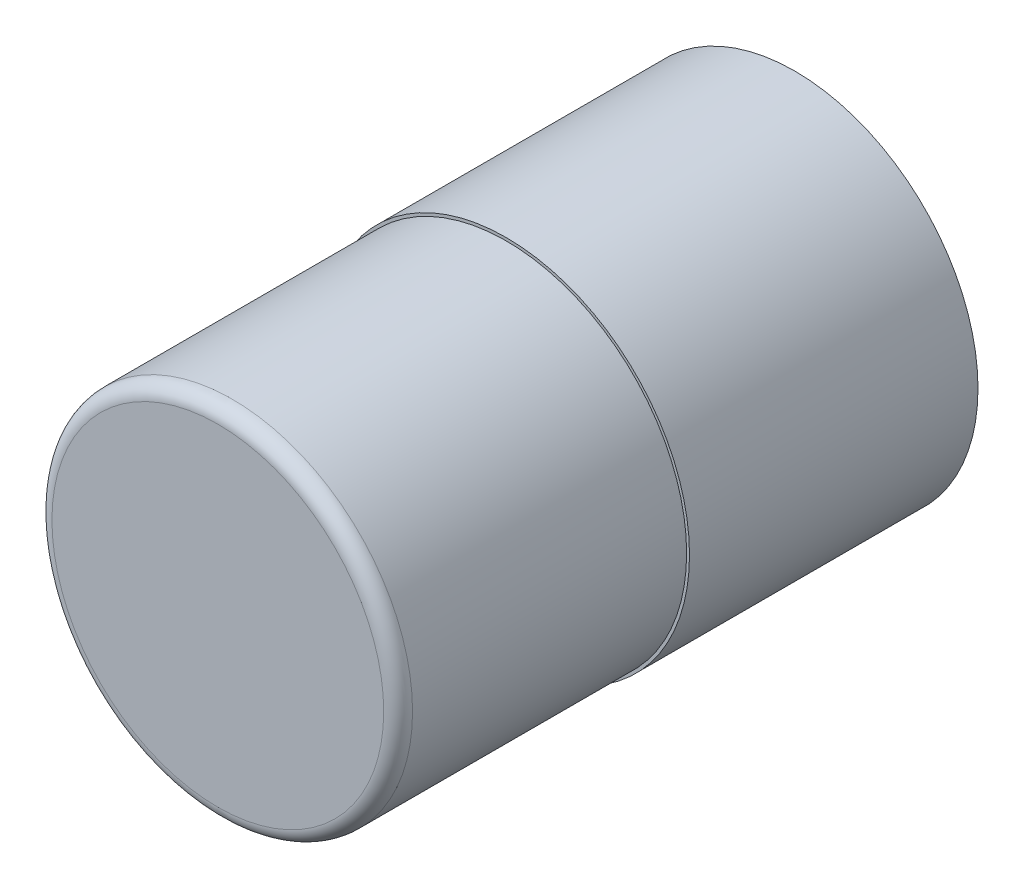
ISO-10303-21;
HEADER;
FILE_DESCRIPTION(('STEP AP214'),'2;1');
FILE_NAME('part.step','',(''),(''),'','','');
FILE_SCHEMA(('AUTOMOTIVE_DESIGN { 1 0 10303 214 1 1 1 1 }'));
ENDSEC;
DATA;
#1=APPLICATION_CONTEXT('core data for automotive mechanical design processes');
#2=APPLICATION_PROTOCOL_DEFINITION('international standard','automotive_design',2000,#1);
#3=PRODUCT_CONTEXT('',#1,'mechanical');
#4=PRODUCT('Part','Part','',(#3));
#5=PRODUCT_RELATED_PRODUCT_CATEGORY('part','',(#4));
#6=PRODUCT_DEFINITION_FORMATION('','',#4);
#7=PRODUCT_DEFINITION_CONTEXT('part definition',#1,'design');
#8=PRODUCT_DEFINITION('design','',#6,#7);
#9=PRODUCT_DEFINITION_SHAPE('','',#8);
#10=(LENGTH_UNIT() NAMED_UNIT(*) SI_UNIT(.MILLI.,.METRE.));
#11=(NAMED_UNIT(*) PLANE_ANGLE_UNIT() SI_UNIT($,.RADIAN.));
#12=(NAMED_UNIT(*) SI_UNIT($,.STERADIAN.) SOLID_ANGLE_UNIT());
#13=UNCERTAINTY_MEASURE_WITH_UNIT(LENGTH_MEASURE(1.E-05),#10,'distance_accuracy_value','');
#14=(GEOMETRIC_REPRESENTATION_CONTEXT(3) GLOBAL_UNCERTAINTY_ASSIGNED_CONTEXT((#13)) GLOBAL_UNIT_ASSIGNED_CONTEXT((#10,
#11,#12)) REPRESENTATION_CONTEXT('',''));
#15=CARTESIAN_POINT('',(0.,0.,0.));
#16=DIRECTION('',(0.,0.,1.));
#17=DIRECTION('',(1.,0.,0.));
#18=AXIS2_PLACEMENT_3D('',#15,#16,#17);
#19=CARTESIAN_POINT('',(0.,0.,10.));
#20=DIRECTION('',(0.,0.,-1.));
#21=DIRECTION('',(-1.,0.,0.));
#22=AXIS2_PLACEMENT_3D('',#19,#20,#21);
#23=CYLINDRICAL_SURFACE('',#22,6.35);
#24=CARTESIAN_POINT('',(0.,0.,0.));
#25=DIRECTION('',(0.,0.,1.));
#26=DIRECTION('',(1.,0.,0.));
#27=AXIS2_PLACEMENT_3D('',#24,#25,#26);
#28=CIRCLE('',#27,6.35);
#29=CARTESIAN_POINT('',(6.35,0.,0.));
#30=VERTEX_POINT('',#29);
#31=EDGE_CURVE('E47',#30,#30,#28,.T.);
#32=ORIENTED_EDGE('',*,*,#31,.T.);
#33=EDGE_LOOP('',(#32));
#34=FACE_BOUND('',#33,.T.);
#35=CARTESIAN_POINT('',(0.,0.,10.));
#36=DIRECTION('',(0.,0.,1.));
#37=DIRECTION('',(1.00000000000005,0.,0.));
#38=AXIS2_PLACEMENT_3D('',#35,#36,#37);
#39=CIRCLE('',#38,6.35);
#40=CARTESIAN_POINT('',(6.35000000000035,0.,10.));
#41=VERTEX_POINT('',#40);
#42=EDGE_CURVE('E59',#41,#41,#39,.T.);
#43=ORIENTED_EDGE('',*,*,#42,.F.);
#44=EDGE_LOOP('',(#43));
#45=FACE_BOUND('',#44,.T.);
#46=ADVANCED_FACE('F36',(#34,#45),#23,.T.);
#47=CARTESIAN_POINT('',(0.,0.,0.));
#48=DIRECTION('',(0.,0.,1.));
#49=DIRECTION('',(1.,0.,0.));
#50=AXIS2_PLACEMENT_3D('',#47,#48,#49);
#51=PLANE('',#50);
#52=ORIENTED_EDGE('',*,*,#31,.F.);
#53=EDGE_LOOP('',(#52));
#54=FACE_BOUND('',#53,.T.);
#55=CARTESIAN_POINT('',(0.,0.,0.));
#56=DIRECTION('',(0.,0.,1.));
#57=DIRECTION('',(1.,0.,0.));
#58=AXIS2_PLACEMENT_3D('',#55,#56,#57);
#59=CIRCLE('',#58,2.8);
#60=CARTESIAN_POINT('',(2.8,0.,0.));
#61=VERTEX_POINT('',#60);
#62=EDGE_CURVE('E51',#61,#61,#59,.T.);
#63=ORIENTED_EDGE('',*,*,#62,.T.);
#64=EDGE_LOOP('',(#63));
#65=FACE_BOUND('',#64,.T.);
#66=ADVANCED_FACE('F76',(#54,#65),#51,.F.);
#67=CARTESIAN_POINT('',(0.,0.,10.));
#68=DIRECTION('',(0.,0.,-1.));
#69=DIRECTION('',(-1.,0.,0.));
#70=AXIS2_PLACEMENT_3D('',#67,#68,#69);
#71=CYLINDRICAL_SURFACE('',#70,2.8);
#72=CARTESIAN_POINT('',(0.,0.,10.));
#73=DIRECTION('',(0.,0.,1.));
#74=DIRECTION('',(1.,0.,0.));
#75=AXIS2_PLACEMENT_3D('',#72,#73,#74);
#76=CIRCLE('',#75,2.8);
#77=CARTESIAN_POINT('',(2.8,0.,10.));
#78=VERTEX_POINT('',#77);
#79=EDGE_CURVE('E56',#78,#78,#76,.T.);
#80=ORIENTED_EDGE('',*,*,#79,.T.);
#81=EDGE_LOOP('',(#80));
#82=FACE_BOUND('',#81,.T.);
#83=ORIENTED_EDGE('',*,*,#62,.F.);
#84=EDGE_LOOP('',(#83));
#85=FACE_BOUND('',#84,.T.);
#86=ADVANCED_FACE('F81',(#82,#85),#71,.F.);
#87=CARTESIAN_POINT('',(0.,0.,10.));
#88=DIRECTION('',(0.,0.,1.));
#89=DIRECTION('',(1.,0.,0.));
#90=AXIS2_PLACEMENT_3D('',#87,#88,#89);
#91=PLANE('',#90);
#92=ORIENTED_EDGE('',*,*,#79,.F.);
#93=EDGE_LOOP('',(#92));
#94=FACE_BOUND('',#93,.T.);
#95=ADVANCED_FACE('F87',(#94),#91,.F.);
#96=CARTESIAN_POINT('',(0.,0.,10.));
#97=DIRECTION('',(0.,0.,1.));
#98=DIRECTION('',(1.,0.,0.));
#99=AXIS2_PLACEMENT_3D('',#96,#97,#98);
#100=CYLINDRICAL_SURFACE('',#99,6.25);
#101=CARTESIAN_POINT('',(0.,0.,19.5));
#102=DIRECTION('',(0.,0.,1.));
#103=DIRECTION('',(1.,0.,0.));
#104=AXIS2_PLACEMENT_3D('',#101,#102,#103);
#105=CIRCLE('',#104,6.25);
#106=CARTESIAN_POINT('',(6.25,0.,19.5));
#107=VERTEX_POINT('',#106);
#108=EDGE_CURVE('E10',#107,#107,#105,.F.);
#109=ORIENTED_EDGE('',*,*,#108,.T.);
#110=EDGE_LOOP('',(#109));
#111=FACE_BOUND('',#110,.T.);
#112=CARTESIAN_POINT('',(0.,0.,10.));
#113=DIRECTION('',(0.,0.,1.));
#114=DIRECTION('',(1.00000000000005,0.,0.));
#115=AXIS2_PLACEMENT_3D('',#112,#113,#114);
#116=CIRCLE('',#115,6.25);
#117=CARTESIAN_POINT('',(6.25000000000034,0.,10.));
#118=VERTEX_POINT('',#117);
#119=EDGE_CURVE('E62',#118,#118,#116,.T.);
#120=ORIENTED_EDGE('',*,*,#119,.T.);
#121=EDGE_LOOP('',(#120));
#122=FACE_BOUND('',#121,.T.);
#123=ADVANCED_FACE('F66',(#111,#122),#100,.T.);
#124=CARTESIAN_POINT('',(0.,0.,10.));
#125=DIRECTION('',(0.,0.,1.));
#126=DIRECTION('',(1.00000000000005,0.,0.));
#127=AXIS2_PLACEMENT_3D('',#124,#125,#126);
#128=PLANE('',#127);
#129=ORIENTED_EDGE('',*,*,#119,.F.);
#130=EDGE_LOOP('',(#129));
#131=FACE_BOUND('',#130,.T.);
#132=ORIENTED_EDGE('',*,*,#42,.T.);
#133=EDGE_LOOP('',(#132));
#134=FACE_BOUND('',#133,.T.);
#135=ADVANCED_FACE('F68',(#131,#134),#128,.T.);
#136=CARTESIAN_POINT('',(0.,0.,20.));
#137=DIRECTION('',(0.,0.,1.));
#138=DIRECTION('',(1.,0.,0.));
#139=AXIS2_PLACEMENT_3D('',#136,#137,#138);
#140=PLANE('',#139);
#141=CARTESIAN_POINT('',(0.,0.,20.));
#142=DIRECTION('',(0.,0.,1.));
#143=DIRECTION('',(1.,0.,0.));
#144=AXIS2_PLACEMENT_3D('',#141,#142,#143);
#145=CIRCLE('',#144,5.75);
#146=CARTESIAN_POINT('',(5.75,0.,20.));
#147=VERTEX_POINT('',#146);
#148=EDGE_CURVE('E43',#147,#147,#145,.T.);
#149=ORIENTED_EDGE('',*,*,#148,.T.);
#150=EDGE_LOOP('',(#149));
#151=FACE_BOUND('',#150,.T.);
#152=ADVANCED_FACE('F71',(#151),#140,.T.);
#153=CARTESIAN_POINT('',(0.,0.,19.5));
#154=DIRECTION('',(0.,0.,1.));
#155=DIRECTION('',(1.,0.,0.));
#156=AXIS2_PLACEMENT_3D('',#153,#154,#155);
#157=TOROIDAL_SURFACE('',#156,5.75,0.5);
#158=ORIENTED_EDGE('',*,*,#108,.F.);
#159=EDGE_LOOP('',(#158));
#160=FACE_BOUND('',#159,.T.);
#161=ORIENTED_EDGE('',*,*,#148,.F.);
#162=EDGE_LOOP('',(#161));
#163=FACE_BOUND('',#162,.T.);
#164=ADVANCED_FACE('F38',(#160,#163),#157,.T.);
#165=CLOSED_SHELL('',(#46,#66,#86,#95,#123,#135,#152,#164));
#166=MANIFOLD_SOLID_BREP('B2',#165);
#167=ADVANCED_BREP_SHAPE_REPRESENTATION('',(#18,#166),#14);
#168=SHAPE_DEFINITION_REPRESENTATION(#9,#167);
ENDSEC;
END-ISO-10303-21;
